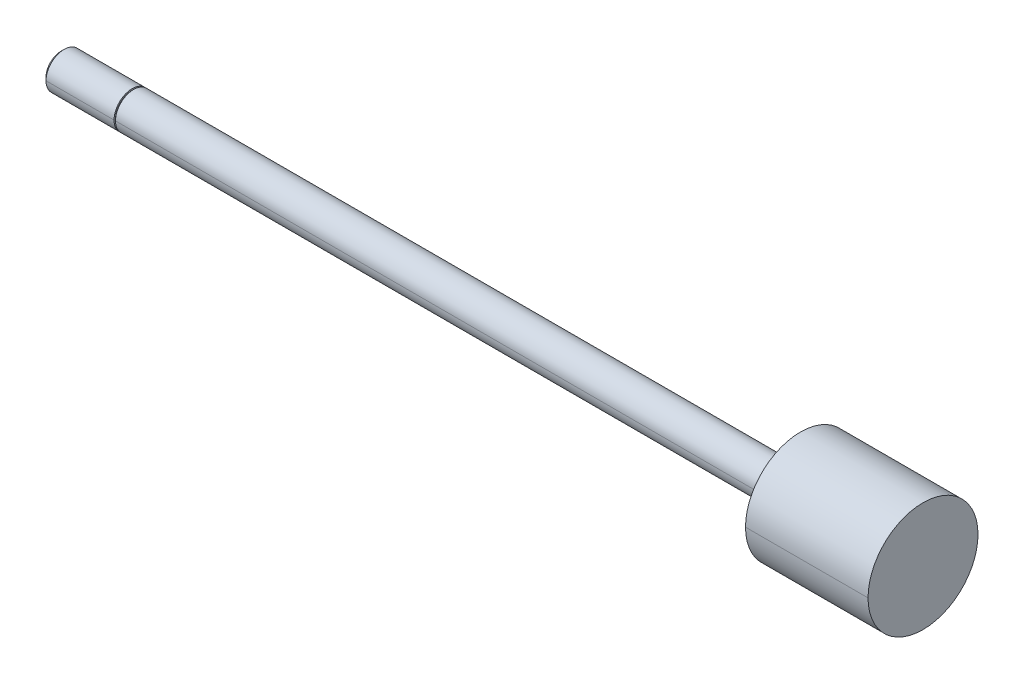
ISO-10303-21;
HEADER;
FILE_DESCRIPTION(('STEP AP214'),'2;1');
FILE_NAME('part.step','',(''),(''),'','','');
FILE_SCHEMA(('AUTOMOTIVE_DESIGN { 1 0 10303 214 1 1 1 1 }'));
ENDSEC;
DATA;
#1=APPLICATION_CONTEXT('core data for automotive mechanical design processes');
#2=APPLICATION_PROTOCOL_DEFINITION('international standard','automotive_design',2000,#1);
#3=PRODUCT_CONTEXT('',#1,'mechanical');
#4=PRODUCT('Part','Part','',(#3));
#5=PRODUCT_RELATED_PRODUCT_CATEGORY('part','',(#4));
#6=PRODUCT_DEFINITION_FORMATION('','',#4);
#7=PRODUCT_DEFINITION_CONTEXT('part definition',#1,'design');
#8=PRODUCT_DEFINITION('design','',#6,#7);
#9=PRODUCT_DEFINITION_SHAPE('','',#8);
#10=(LENGTH_UNIT() NAMED_UNIT(*) SI_UNIT(.MILLI.,.METRE.));
#11=(NAMED_UNIT(*) PLANE_ANGLE_UNIT() SI_UNIT($,.RADIAN.));
#12=(NAMED_UNIT(*) SI_UNIT($,.STERADIAN.) SOLID_ANGLE_UNIT());
#13=UNCERTAINTY_MEASURE_WITH_UNIT(LENGTH_MEASURE(1.E-05),#10,'distance_accuracy_value','');
#14=(GEOMETRIC_REPRESENTATION_CONTEXT(3) GLOBAL_UNCERTAINTY_ASSIGNED_CONTEXT((#13)) GLOBAL_UNIT_ASSIGNED_CONTEXT((#10,
#11,#12)) REPRESENTATION_CONTEXT('',''));
#15=CARTESIAN_POINT('',(0.,0.,0.));
#16=DIRECTION('',(0.,0.,1.));
#17=DIRECTION('',(1.,0.,0.));
#18=AXIS2_PLACEMENT_3D('',#15,#16,#17);
#19=CARTESIAN_POINT('',(0.,0.,0.));
#20=DIRECTION('',(-1.,0.,0.));
#21=DIRECTION('',(0.,-1.,0.));
#22=AXIS2_PLACEMENT_3D('',#19,#20,#21);
#23=CYLINDRICAL_SURFACE('',#22,2.921);
#24=CARTESIAN_POINT('',(0.,0.,0.));
#25=DIRECTION('',(1.,0.,0.));
#26=DIRECTION('',(0.,0.,-1.));
#27=AXIS2_PLACEMENT_3D('',#24,#25,#26);
#28=CIRCLE('',#27,2.921);
#29=CARTESIAN_POINT('',(0.,0.,-2.921));
#30=VERTEX_POINT('',#29);
#31=CARTESIAN_POINT('',(0.,0.,2.921));
#32=VERTEX_POINT('',#31);
#33=EDGE_CURVE('E11',#30,#32,#28,.T.);
#34=ORIENTED_EDGE('',*,*,#33,.F.);
#35=DIRECTION('',(-1.,0.,0.));
#36=VECTOR('',#35,1.);
#37=CARTESIAN_POINT('',(0.,0.,-2.921));
#38=LINE('',#37,#36);
#39=CARTESIAN_POINT('',(-0.254,0.,-2.921));
#40=VERTEX_POINT('',#39);
#41=EDGE_CURVE('E24',#30,#40,#38,.T.);
#42=ORIENTED_EDGE('',*,*,#41,.T.);
#43=CARTESIAN_POINT('',(-0.254,0.,0.));
#44=DIRECTION('',(1.,0.,0.));
#45=DIRECTION('',(0.,0.,-1.));
#46=AXIS2_PLACEMENT_3D('',#43,#44,#45);
#47=CIRCLE('',#46,2.921);
#48=CARTESIAN_POINT('',(-0.254,0.,2.921));
#49=VERTEX_POINT('',#48);
#50=EDGE_CURVE('E210',#40,#49,#47,.T.);
#51=ORIENTED_EDGE('',*,*,#50,.T.);
#52=DIRECTION('',(-1.,0.,0.));
#53=VECTOR('',#52,1.);
#54=CARTESIAN_POINT('',(0.,0.,2.921));
#55=LINE('',#54,#53);
#56=EDGE_CURVE('E205',#32,#49,#55,.T.);
#57=ORIENTED_EDGE('',*,*,#56,.F.);
#58=EDGE_LOOP('',(#34,#42,#51,#57));
#59=FACE_BOUND('',#58,.T.);
#60=ADVANCED_FACE('F16',(#59),#23,.T.);
#61=CARTESIAN_POINT('',(0.,0.,0.));
#62=DIRECTION('',(-1.,0.,0.));
#63=DIRECTION('',(0.,1.,0.));
#64=AXIS2_PLACEMENT_3D('',#61,#62,#63);
#65=CYLINDRICAL_SURFACE('',#64,2.921);
#66=CARTESIAN_POINT('',(-0.254,0.,0.));
#67=DIRECTION('',(1.,0.,0.));
#68=DIRECTION('',(0.,0.,-1.));
#69=AXIS2_PLACEMENT_3D('',#66,#67,#68);
#70=CIRCLE('',#69,2.921);
#71=EDGE_CURVE('E201',#49,#40,#70,.T.);
#72=ORIENTED_EDGE('',*,*,#71,.T.);
#73=ORIENTED_EDGE('',*,*,#41,.F.);
#74=CARTESIAN_POINT('',(0.,0.,0.));
#75=DIRECTION('',(1.,0.,0.));
#76=DIRECTION('',(0.,0.,-1.));
#77=AXIS2_PLACEMENT_3D('',#74,#75,#76);
#78=CIRCLE('',#77,2.921);
#79=EDGE_CURVE('E196',#32,#30,#78,.T.);
#80=ORIENTED_EDGE('',*,*,#79,.F.);
#81=ORIENTED_EDGE('',*,*,#56,.T.);
#82=EDGE_LOOP('',(#72,#73,#80,#81));
#83=FACE_BOUND('',#82,.T.);
#84=ADVANCED_FACE('F223',(#83),#65,.T.);
#85=CARTESIAN_POINT('',(0.,2.921,0.));
#86=DIRECTION('',(1.,0.,0.));
#87=DIRECTION('',(0.,0.,-1.));
#88=AXIS2_PLACEMENT_3D('',#85,#86,#87);
#89=PLANE('',#88);
#90=CARTESIAN_POINT('',(0.,0.,0.));
#91=DIRECTION('',(1.,0.,0.));
#92=DIRECTION('',(0.,0.,-1.));
#93=AXIS2_PLACEMENT_3D('',#90,#91,#92);
#94=CIRCLE('',#93,3.175);
#95=CARTESIAN_POINT('',(0.,0.,-3.175));
#96=VERTEX_POINT('',#95);
#97=CARTESIAN_POINT('',(0.,0.,3.175));
#98=VERTEX_POINT('',#97);
#99=EDGE_CURVE('E191',#96,#98,#94,.T.);
#100=ORIENTED_EDGE('',*,*,#99,.F.);
#101=CARTESIAN_POINT('',(0.,0.,0.));
#102=DIRECTION('',(1.,0.,0.));
#103=DIRECTION('',(0.,0.,-1.));
#104=AXIS2_PLACEMENT_3D('',#101,#102,#103);
#105=CIRCLE('',#104,3.175);
#106=EDGE_CURVE('E186',#98,#96,#105,.T.);
#107=ORIENTED_EDGE('',*,*,#106,.F.);
#108=EDGE_LOOP('',(#100,#107));
#109=FACE_BOUND('',#108,.T.);
#110=ORIENTED_EDGE('',*,*,#33,.T.);
#111=ORIENTED_EDGE('',*,*,#79,.T.);
#112=EDGE_LOOP('',(#110,#111));
#113=FACE_BOUND('',#112,.T.);
#114=ADVANCED_FACE('F248',(#109,#113),#89,.F.);
#115=CARTESIAN_POINT('',(138.1252,0.,0.));
#116=DIRECTION('',(-1.,0.,0.));
#117=DIRECTION('',(0.,1.,0.));
#118=AXIS2_PLACEMENT_3D('',#115,#116,#117);
#119=CYLINDRICAL_SURFACE('',#118,3.175);
#120=ORIENTED_EDGE('',*,*,#106,.T.);
#121=DIRECTION('',(-1.,0.,0.));
#122=VECTOR('',#121,1.);
#123=CARTESIAN_POINT('',(116.6876,0.,-3.175));
#124=LINE('',#123,#122);
#125=CARTESIAN_POINT('',(116.6876,0.,-3.175));
#126=VERTEX_POINT('',#125);
#127=EDGE_CURVE('E181',#126,#96,#124,.T.);
#128=ORIENTED_EDGE('',*,*,#127,.F.);
#129=CARTESIAN_POINT('',(116.6876,0.,0.));
#130=DIRECTION('',(1.,0.,0.));
#131=DIRECTION('',(0.,0.,-1.));
#132=AXIS2_PLACEMENT_3D('',#129,#130,#131);
#133=CIRCLE('',#132,3.175);
#134=CARTESIAN_POINT('',(116.6876,0.,3.175));
#135=VERTEX_POINT('',#134);
#136=EDGE_CURVE('E176',#135,#126,#133,.T.);
#137=ORIENTED_EDGE('',*,*,#136,.F.);
#138=DIRECTION('',(-1.,0.,0.));
#139=VECTOR('',#138,1.);
#140=CARTESIAN_POINT('',(116.6876,0.,3.175));
#141=LINE('',#140,#139);
#142=EDGE_CURVE('E171',#135,#98,#141,.T.);
#143=ORIENTED_EDGE('',*,*,#142,.T.);
#144=EDGE_LOOP('',(#120,#128,#137,#143));
#145=FACE_BOUND('',#144,.T.);
#146=ADVANCED_FACE('F252',(#145),#119,.T.);
#147=CARTESIAN_POINT('',(138.1252,0.,0.));
#148=DIRECTION('',(-1.,0.,0.));
#149=DIRECTION('',(0.,-1.,0.));
#150=AXIS2_PLACEMENT_3D('',#147,#148,#149);
#151=CYLINDRICAL_SURFACE('',#150,3.175);
#152=CARTESIAN_POINT('',(116.6876,0.,0.));
#153=DIRECTION('',(1.,0.,0.));
#154=DIRECTION('',(0.,0.,-1.));
#155=AXIS2_PLACEMENT_3D('',#152,#153,#154);
#156=CIRCLE('',#155,3.175);
#157=EDGE_CURVE('E166',#126,#135,#156,.T.);
#158=ORIENTED_EDGE('',*,*,#157,.F.);
#159=ORIENTED_EDGE('',*,*,#127,.T.);
#160=ORIENTED_EDGE('',*,*,#99,.T.);
#161=ORIENTED_EDGE('',*,*,#142,.F.);
#162=EDGE_LOOP('',(#158,#159,#160,#161));
#163=FACE_BOUND('',#162,.T.);
#164=ADVANCED_FACE('F258',(#163),#151,.T.);
#165=CARTESIAN_POINT('',(116.6876,3.175,0.));
#166=DIRECTION('',(1.,0.,0.));
#167=DIRECTION('',(0.,0.,-1.));
#168=AXIS2_PLACEMENT_3D('',#165,#166,#167);
#169=PLANE('',#168);
#170=CARTESIAN_POINT('',(116.6876,0.,0.));
#171=DIRECTION('',(1.,0.,0.));
#172=DIRECTION('',(0.,0.,-1.));
#173=AXIS2_PLACEMENT_3D('',#170,#171,#172);
#174=CIRCLE('',#173,9.62025);
#175=CARTESIAN_POINT('',(116.6876,0.,-9.62025));
#176=VERTEX_POINT('',#175);
#177=CARTESIAN_POINT('',(116.6876,0.,9.62025));
#178=VERTEX_POINT('',#177);
#179=EDGE_CURVE('E161',#176,#178,#174,.T.);
#180=ORIENTED_EDGE('',*,*,#179,.F.);
#181=CARTESIAN_POINT('',(116.6876,0.,0.));
#182=DIRECTION('',(1.,0.,0.));
#183=DIRECTION('',(0.,0.,-1.));
#184=AXIS2_PLACEMENT_3D('',#181,#182,#183);
#185=CIRCLE('',#184,9.62025);
#186=EDGE_CURVE('E156',#178,#176,#185,.T.);
#187=ORIENTED_EDGE('',*,*,#186,.F.);
#188=EDGE_LOOP('',(#180,#187));
#189=FACE_BOUND('',#188,.T.);
#190=ORIENTED_EDGE('',*,*,#157,.T.);
#191=ORIENTED_EDGE('',*,*,#136,.T.);
#192=EDGE_LOOP('',(#190,#191));
#193=FACE_BOUND('',#192,.T.);
#194=ADVANCED_FACE('F262',(#189,#193),#169,.F.);
#195=CARTESIAN_POINT('',(138.1252,0.,0.));
#196=DIRECTION('',(-1.,0.,0.));
#197=DIRECTION('',(0.,1.,0.));
#198=AXIS2_PLACEMENT_3D('',#195,#196,#197);
#199=CYLINDRICAL_SURFACE('',#198,9.62025);
#200=ORIENTED_EDGE('',*,*,#186,.T.);
#201=DIRECTION('',(-1.,0.,0.));
#202=VECTOR('',#201,1.);
#203=CARTESIAN_POINT('',(138.1252,0.,-9.62025));
#204=LINE('',#203,#202);
#205=CARTESIAN_POINT('',(138.1252,0.,-9.62025));
#206=VERTEX_POINT('',#205);
#207=EDGE_CURVE('E151',#206,#176,#204,.T.);
#208=ORIENTED_EDGE('',*,*,#207,.F.);
#209=CARTESIAN_POINT('',(138.1252,0.,0.));
#210=DIRECTION('',(1.,0.,0.));
#211=DIRECTION('',(0.,0.,-1.));
#212=AXIS2_PLACEMENT_3D('',#209,#210,#211);
#213=CIRCLE('',#212,9.62025);
#214=CARTESIAN_POINT('',(138.1252,0.,9.62025));
#215=VERTEX_POINT('',#214);
#216=EDGE_CURVE('E146',#215,#206,#213,.T.);
#217=ORIENTED_EDGE('',*,*,#216,.F.);
#218=DIRECTION('',(-1.,0.,0.));
#219=VECTOR('',#218,1.);
#220=CARTESIAN_POINT('',(138.1252,0.,9.62025));
#221=LINE('',#220,#219);
#222=EDGE_CURVE('E141',#215,#178,#221,.T.);
#223=ORIENTED_EDGE('',*,*,#222,.T.);
#224=EDGE_LOOP('',(#200,#208,#217,#223));
#225=FACE_BOUND('',#224,.T.);
#226=ADVANCED_FACE('F266',(#225),#199,.T.);
#227=CARTESIAN_POINT('',(138.1252,0.,0.));
#228=DIRECTION('',(-1.,0.,0.));
#229=DIRECTION('',(0.,-1.,0.));
#230=AXIS2_PLACEMENT_3D('',#227,#228,#229);
#231=CYLINDRICAL_SURFACE('',#230,9.62025);
#232=CARTESIAN_POINT('',(138.1252,0.,0.));
#233=DIRECTION('',(1.,0.,0.));
#234=DIRECTION('',(0.,0.,-1.));
#235=AXIS2_PLACEMENT_3D('',#232,#233,#234);
#236=CIRCLE('',#235,9.62025);
#237=EDGE_CURVE('E136',#206,#215,#236,.T.);
#238=ORIENTED_EDGE('',*,*,#237,.F.);
#239=ORIENTED_EDGE('',*,*,#207,.T.);
#240=ORIENTED_EDGE('',*,*,#179,.T.);
#241=ORIENTED_EDGE('',*,*,#222,.F.);
#242=EDGE_LOOP('',(#238,#239,#240,#241));
#243=FACE_BOUND('',#242,.T.);
#244=ADVANCED_FACE('F270',(#243),#231,.T.);
#245=CARTESIAN_POINT('',(138.1252,9.62025,0.));
#246=DIRECTION('',(-1.,0.,0.));
#247=DIRECTION('',(0.,0.,1.));
#248=AXIS2_PLACEMENT_3D('',#245,#246,#247);
#249=PLANE('',#248);
#250=ORIENTED_EDGE('',*,*,#237,.T.);
#251=ORIENTED_EDGE('',*,*,#216,.T.);
#252=EDGE_LOOP('',(#250,#251));
#253=FACE_BOUND('',#252,.T.);
#254=ADVANCED_FACE('F228',(#253),#249,.F.);
#255=CARTESIAN_POINT('',(-0.254,3.429,0.));
#256=DIRECTION('',(-1.,0.,0.));
#257=DIRECTION('',(0.,0.,1.));
#258=AXIS2_PLACEMENT_3D('',#255,#256,#257);
#259=PLANE('',#258);
#260=ORIENTED_EDGE('',*,*,#50,.F.);
#261=ORIENTED_EDGE('',*,*,#71,.F.);
#262=EDGE_LOOP('',(#260,#261));
#263=FACE_BOUND('',#262,.T.);
#264=CARTESIAN_POINT('',(-0.254000000000005,0.,0.));
#265=DIRECTION('',(-1.,0.,0.));
#266=DIRECTION('',(0.,0.,1.));
#267=AXIS2_PLACEMENT_3D('',#264,#265,#266);
#268=CIRCLE('',#267,3.175);
#269=CARTESIAN_POINT('',(-0.254000000000005,0.,3.175));
#270=VERTEX_POINT('',#269);
#271=CARTESIAN_POINT('',(-0.254000000000019,0.,-3.175));
#272=VERTEX_POINT('',#271);
#273=EDGE_CURVE('E131',#270,#272,#268,.T.);
#274=ORIENTED_EDGE('',*,*,#273,.F.);
#275=CARTESIAN_POINT('',(-0.254000000000005,0.,0.));
#276=DIRECTION('',(-1.,0.,0.));
#277=DIRECTION('',(0.,0.,1.));
#278=AXIS2_PLACEMENT_3D('',#275,#276,#277);
#279=CIRCLE('',#278,3.175);
#280=EDGE_CURVE('E126',#272,#270,#279,.T.);
#281=ORIENTED_EDGE('',*,*,#280,.F.);
#282=EDGE_LOOP('',(#274,#281));
#283=FACE_BOUND('',#282,.T.);
#284=ADVANCED_FACE('F224',(#263,#283),#259,.F.);
#285=CARTESIAN_POINT('',(138.1252,0.,0.));
#286=DIRECTION('',(-1.,0.,0.));
#287=DIRECTION('',(0.,1.,0.));
#288=AXIS2_PLACEMENT_3D('',#285,#286,#287);
#289=CYLINDRICAL_SURFACE('',#288,3.175);
#290=CARTESIAN_POINT('',(-12.15898,0.,0.));
#291=DIRECTION('',(1.,0.,0.));
#292=DIRECTION('',(0.,0.,-1.));
#293=AXIS2_PLACEMENT_3D('',#290,#291,#292);
#294=CIRCLE('',#293,3.175);
#295=CARTESIAN_POINT('',(-12.15898,0.,3.175));
#296=VERTEX_POINT('',#295);
#297=CARTESIAN_POINT('',(-12.15898,0.,-3.175));
#298=VERTEX_POINT('',#297);
#299=EDGE_CURVE('E97',#296,#298,#294,.T.);
#300=ORIENTED_EDGE('',*,*,#299,.T.);
#301=DIRECTION('',(-1.,0.,0.));
#302=VECTOR('',#301,1.);
#303=CARTESIAN_POINT('',(-0.254000000000019,0.,-3.175));
#304=LINE('',#303,#302);
#305=EDGE_CURVE('E118',#272,#298,#304,.T.);
#306=ORIENTED_EDGE('',*,*,#305,.F.);
#307=ORIENTED_EDGE('',*,*,#280,.T.);
#308=DIRECTION('',(-1.,0.,0.));
#309=VECTOR('',#308,1.);
#310=CARTESIAN_POINT('',(-0.254000000000019,0.,3.175));
#311=LINE('',#310,#309);
#312=EDGE_CURVE('E114',#270,#296,#311,.T.);
#313=ORIENTED_EDGE('',*,*,#312,.T.);
#314=EDGE_LOOP('',(#300,#306,#307,#313));
#315=FACE_BOUND('',#314,.T.);
#316=ADVANCED_FACE('F227',(#315),#289,.T.);
#317=CARTESIAN_POINT('',(138.1252,0.,0.));
#318=DIRECTION('',(-1.,0.,0.));
#319=DIRECTION('',(0.,-1.,0.));
#320=AXIS2_PLACEMENT_3D('',#317,#318,#319);
#321=CYLINDRICAL_SURFACE('',#320,3.175);
#322=ORIENTED_EDGE('',*,*,#273,.T.);
#323=ORIENTED_EDGE('',*,*,#305,.T.);
#324=CARTESIAN_POINT('',(-12.15898,0.,0.));
#325=DIRECTION('',(1.,0.,0.));
#326=DIRECTION('',(0.,0.,-1.));
#327=AXIS2_PLACEMENT_3D('',#324,#325,#326);
#328=CIRCLE('',#327,3.175);
#329=EDGE_CURVE('E109',#298,#296,#328,.T.);
#330=ORIENTED_EDGE('',*,*,#329,.T.);
#331=ORIENTED_EDGE('',*,*,#312,.F.);
#332=EDGE_LOOP('',(#322,#323,#330,#331));
#333=FACE_BOUND('',#332,.T.);
#334=ADVANCED_FACE('F234',(#333),#321,.T.);
#335=CARTESIAN_POINT('',(-12.7,0.,0.));
#336=DIRECTION('',(1.,0.,0.));
#337=DIRECTION('',(0.,-1.,0.));
#338=AXIS2_PLACEMENT_3D('',#335,#336,#337);
#339=CONICAL_SURFACE('',#338,2.63398,0.7853981634);
#340=ORIENTED_EDGE('',*,*,#329,.F.);
#341=DIRECTION('',(0.707106781184742,0.,-0.707106781188353));
#342=VECTOR('',#341,1.);
#343=CARTESIAN_POINT('',(-12.7,0.,-2.63398));
#344=LINE('',#343,#342);
#345=CARTESIAN_POINT('',(-12.7,0.,-2.63398));
#346=VERTEX_POINT('',#345);
#347=EDGE_CURVE('E89',#346,#298,#344,.T.);
#348=ORIENTED_EDGE('',*,*,#347,.F.);
#349=CARTESIAN_POINT('',(-12.7,0.,0.));
#350=DIRECTION('',(1.,0.,0.));
#351=DIRECTION('',(0.,0.,-1.));
#352=AXIS2_PLACEMENT_3D('',#349,#350,#351);
#353=CIRCLE('',#352,2.63398);
#354=CARTESIAN_POINT('',(-12.7,0.,2.63398));
#355=VERTEX_POINT('',#354);
#356=EDGE_CURVE('E82',#346,#355,#353,.T.);
#357=ORIENTED_EDGE('',*,*,#356,.T.);
#358=DIRECTION('',(0.707106781184742,0.,0.707106781188353));
#359=VECTOR('',#358,1.);
#360=CARTESIAN_POINT('',(-12.7,0.,2.63398));
#361=LINE('',#360,#359);
#362=EDGE_CURVE('E86',#355,#296,#361,.T.);
#363=ORIENTED_EDGE('',*,*,#362,.T.);
#364=EDGE_LOOP('',(#340,#348,#357,#363));
#365=FACE_BOUND('',#364,.T.);
#366=ADVANCED_FACE('F85',(#365),#339,.T.);
#367=CARTESIAN_POINT('',(-12.7,0.,0.));
#368=DIRECTION('',(1.,0.,0.));
#369=DIRECTION('',(0.,1.,0.));
#370=AXIS2_PLACEMENT_3D('',#367,#368,#369);
#371=CONICAL_SURFACE('',#370,2.63398,0.7853981634);
#372=CARTESIAN_POINT('',(-12.7,0.,0.));
#373=DIRECTION('',(1.,0.,0.));
#374=DIRECTION('',(0.,0.,-1.));
#375=AXIS2_PLACEMENT_3D('',#372,#373,#374);
#376=CIRCLE('',#375,2.63398);
#377=EDGE_CURVE('E96',#355,#346,#376,.T.);
#378=ORIENTED_EDGE('',*,*,#377,.T.);
#379=ORIENTED_EDGE('',*,*,#347,.T.);
#380=ORIENTED_EDGE('',*,*,#299,.F.);
#381=ORIENTED_EDGE('',*,*,#362,.F.);
#382=EDGE_LOOP('',(#378,#379,#380,#381));
#383=FACE_BOUND('',#382,.T.);
#384=ADVANCED_FACE('F95',(#383),#371,.T.);
#385=CARTESIAN_POINT('',(-12.7,0.,0.));
#386=DIRECTION('',(1.,0.,0.));
#387=DIRECTION('',(0.,0.,-1.));
#388=AXIS2_PLACEMENT_3D('',#385,#386,#387);
#389=PLANE('',#388);
#390=ORIENTED_EDGE('',*,*,#356,.F.);
#391=ORIENTED_EDGE('',*,*,#377,.F.);
#392=EDGE_LOOP('',(#390,#391));
#393=FACE_BOUND('',#392,.T.);
#394=ADVANCED_FACE('F99',(#393),#389,.F.);
#395=CLOSED_SHELL('',(#60,#84,#114,#146,#164,#194,#226,#244,#254,#284,#316,#334,#366,#384,#394));
#396=MANIFOLD_SOLID_BREP('B1',#395);
#397=ADVANCED_BREP_SHAPE_REPRESENTATION('',(#18,#396),#14);
#398=SHAPE_DEFINITION_REPRESENTATION(#9,#397);
ENDSEC;
END-ISO-10303-21;
